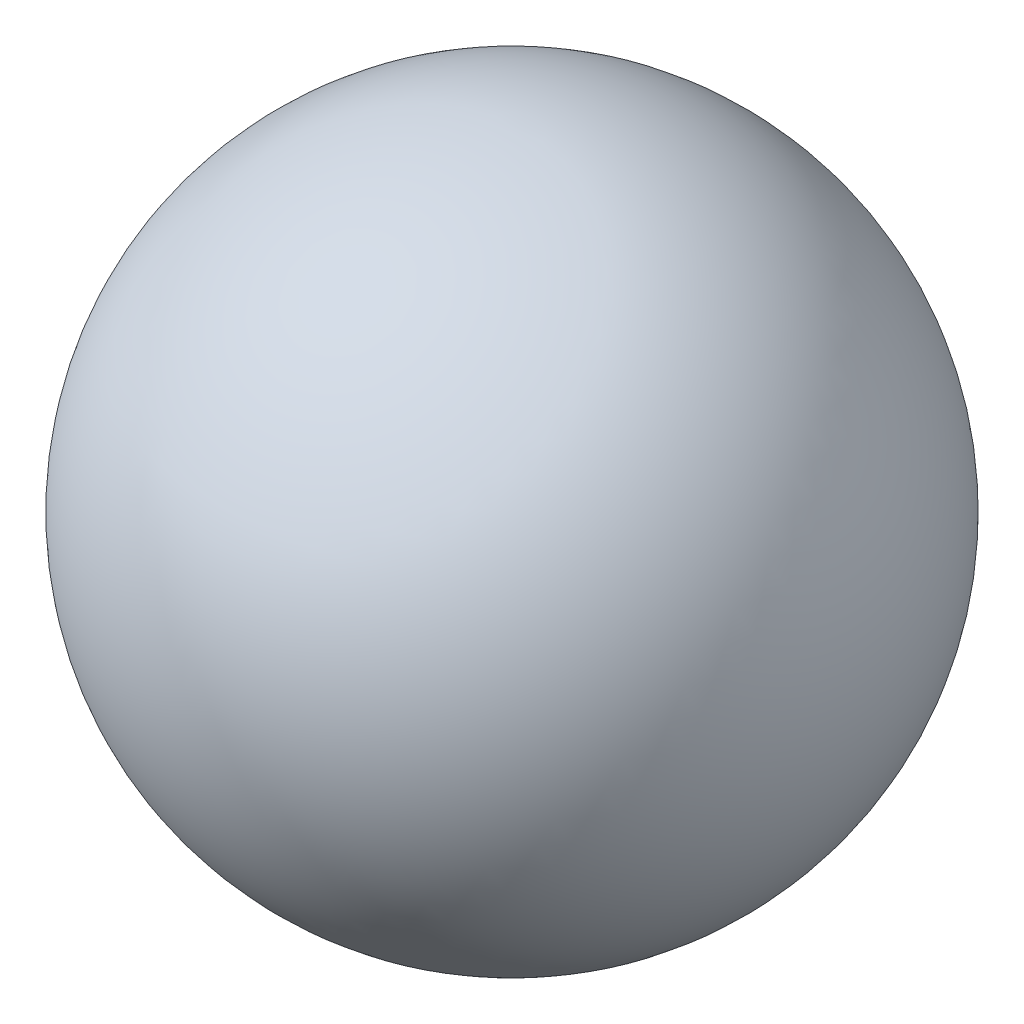
ISO-10303-21;
HEADER;
FILE_DESCRIPTION(('STEP AP214'),'2;1');
FILE_NAME('part.step','',(''),(''),'','','');
FILE_SCHEMA(('AUTOMOTIVE_DESIGN { 1 0 10303 214 1 1 1 1 }'));
ENDSEC;
DATA;
#1=APPLICATION_CONTEXT('core data for automotive mechanical design processes');
#2=APPLICATION_PROTOCOL_DEFINITION('international standard','automotive_design',2000,#1);
#3=PRODUCT_CONTEXT('',#1,'mechanical');
#4=PRODUCT('Part','Part','',(#3));
#5=PRODUCT_RELATED_PRODUCT_CATEGORY('part','',(#4));
#6=PRODUCT_DEFINITION_FORMATION('','',#4);
#7=PRODUCT_DEFINITION_CONTEXT('part definition',#1,'design');
#8=PRODUCT_DEFINITION('design','',#6,#7);
#9=PRODUCT_DEFINITION_SHAPE('','',#8);
#10=(LENGTH_UNIT() NAMED_UNIT(*) SI_UNIT(.MILLI.,.METRE.));
#11=(NAMED_UNIT(*) PLANE_ANGLE_UNIT() SI_UNIT($,.RADIAN.));
#12=(NAMED_UNIT(*) SI_UNIT($,.STERADIAN.) SOLID_ANGLE_UNIT());
#13=UNCERTAINTY_MEASURE_WITH_UNIT(LENGTH_MEASURE(1.E-05),#10,'distance_accuracy_value','');
#14=(GEOMETRIC_REPRESENTATION_CONTEXT(3) GLOBAL_UNCERTAINTY_ASSIGNED_CONTEXT((#13)) GLOBAL_UNIT_ASSIGNED_CONTEXT((#10,
#11,#12)) REPRESENTATION_CONTEXT('',''));
#15=CARTESIAN_POINT('',(0.,0.,0.));
#16=DIRECTION('',(0.,0.,1.));
#17=DIRECTION('',(1.,0.,0.));
#18=AXIS2_PLACEMENT_3D('',#15,#16,#17);
#19=CARTESIAN_POINT('',(0.,37.,0.));
#20=DIRECTION('',(0.,1.,0.));
#21=DIRECTION('',(0.,0.,1.));
#22=AXIS2_PLACEMENT_3D('',#19,#20,#21);
#23=SPHERICAL_SURFACE('',#22,37.);
#24=CARTESIAN_POINT('',(0.,74.,0.));
#25=VERTEX_POINT('',#24);
#26=VERTEX_LOOP('',#25);
#27=FACE_BOUND('',#26,.T.);
#28=ADVANCED_FACE('F28',(#27),#23,.T.);
#29=CLOSED_SHELL('',(#28));
#30=MANIFOLD_SOLID_BREP('B2',#29);
#31=ADVANCED_BREP_SHAPE_REPRESENTATION('',(#18,#30),#14);
#32=SHAPE_DEFINITION_REPRESENTATION(#9,#31);
ENDSEC;
END-ISO-10303-21;
